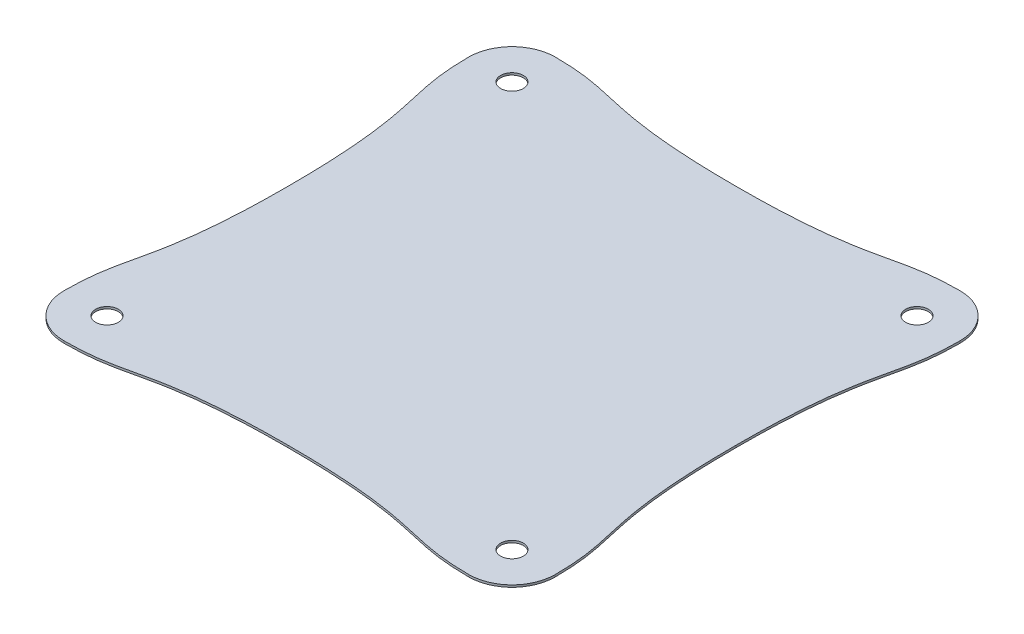
ISO-10303-21;
HEADER;
FILE_DESCRIPTION(('STEP AP214'),'2;1');
FILE_NAME('part.step','',(''),(''),'','','');
FILE_SCHEMA(('AUTOMOTIVE_DESIGN { 1 0 10303 214 1 1 1 1 }'));
ENDSEC;
DATA;
#1=APPLICATION_CONTEXT('core data for automotive mechanical design processes');
#2=APPLICATION_PROTOCOL_DEFINITION('international standard','automotive_design',2000,#1);
#3=PRODUCT_CONTEXT('',#1,'mechanical');
#4=PRODUCT('Part','Part','',(#3));
#5=PRODUCT_RELATED_PRODUCT_CATEGORY('part','',(#4));
#6=PRODUCT_DEFINITION_FORMATION('','',#4);
#7=PRODUCT_DEFINITION_CONTEXT('part definition',#1,'design');
#8=PRODUCT_DEFINITION('design','',#6,#7);
#9=PRODUCT_DEFINITION_SHAPE('','',#8);
#10=(LENGTH_UNIT() NAMED_UNIT(*) SI_UNIT(.MILLI.,.METRE.));
#11=(NAMED_UNIT(*) PLANE_ANGLE_UNIT() SI_UNIT($,.RADIAN.));
#12=(NAMED_UNIT(*) SI_UNIT($,.STERADIAN.) SOLID_ANGLE_UNIT());
#13=UNCERTAINTY_MEASURE_WITH_UNIT(LENGTH_MEASURE(1.E-05),#10,'distance_accuracy_value','');
#14=(GEOMETRIC_REPRESENTATION_CONTEXT(3) GLOBAL_UNCERTAINTY_ASSIGNED_CONTEXT((#13)) GLOBAL_UNIT_ASSIGNED_CONTEXT((#10,
#11,#12)) REPRESENTATION_CONTEXT('',''));
#15=CARTESIAN_POINT('',(0.,0.,0.));
#16=DIRECTION('',(0.,0.,1.));
#17=DIRECTION('',(1.,0.,0.));
#18=AXIS2_PLACEMENT_3D('',#15,#16,#17);
#19=CARTESIAN_POINT('',(0.,0.4,-75.));
#20=DIRECTION('',(0.,-1.,0.));
#21=DIRECTION('',(0.,0.,-1.));
#22=AXIS2_PLACEMENT_3D('',#19,#20,#21);
#23=CYLINDRICAL_SURFACE('',#22,8.);
#24=CARTESIAN_POINT('',(0.,0.,-75.));
#25=DIRECTION('',(0.,1.,0.));
#26=DIRECTION('',(0.,0.,1.));
#27=AXIS2_PLACEMENT_3D('',#24,#25,#26);
#28=CIRCLE('',#27,8.);
#29=CARTESIAN_POINT('',(0.,0.,-83.));
#30=VERTEX_POINT('',#29);
#31=CARTESIAN_POINT('',(-8.,0.,-75.));
#32=VERTEX_POINT('',#31);
#33=EDGE_CURVE('E294',#30,#32,#28,.T.);
#34=ORIENTED_EDGE('',*,*,#33,.T.);
#35=DIRECTION('',(0.,-1.,0.));
#36=VECTOR('',#35,1.);
#37=CARTESIAN_POINT('',(-8.,0.4,-75.));
#38=LINE('',#37,#36);
#39=CARTESIAN_POINT('',(-8.,0.4,-75.));
#40=VERTEX_POINT('',#39);
#41=EDGE_CURVE('E11',#40,#32,#38,.T.);
#42=ORIENTED_EDGE('',*,*,#41,.F.);
#43=CARTESIAN_POINT('',(0.,0.4,-75.));
#44=DIRECTION('',(0.,1.,0.));
#45=DIRECTION('',(0.,0.,1.));
#46=AXIS2_PLACEMENT_3D('',#43,#44,#45);
#47=CIRCLE('',#46,8.);
#48=CARTESIAN_POINT('',(0.,0.4,-83.));
#49=VERTEX_POINT('',#48);
#50=EDGE_CURVE('E366',#49,#40,#47,.T.);
#51=ORIENTED_EDGE('',*,*,#50,.F.);
#52=DIRECTION('',(0.,-1.,0.));
#53=VECTOR('',#52,1.);
#54=CARTESIAN_POINT('',(0.,0.4,-83.));
#55=LINE('',#54,#53);
#56=EDGE_CURVE('E52',#49,#30,#55,.T.);
#57=ORIENTED_EDGE('',*,*,#56,.T.);
#58=EDGE_LOOP('',(#34,#42,#51,#57));
#59=FACE_BOUND('',#58,.T.);
#60=ADVANCED_FACE('F35',(#59),#23,.T.);
#61=CARTESIAN_POINT('',(-7.99999999999906,0.4,-74.9999999999999));
#62=CARTESIAN_POINT('',(-7.99999999999922,0.4,-62.4999999999999));
#63=CARTESIAN_POINT('',(-4.,0.4,-62.5));
#64=CARTESIAN_POINT('',(-4.,0.4,-37.5));
#65=B_SPLINE_CURVE_WITH_KNOTS('',3,(#61,#62,#63,#64),.UNSPECIFIED.,.F.,.F.,(4,4),(0.,1.),.UNSPECIFIED.);
#66=DIRECTION('',(0.,-1.,0.));
#67=VECTOR('',#66,1.);
#68=SURFACE_OF_LINEAR_EXTRUSION('',#65,#67);
#69=CARTESIAN_POINT('',(-7.99999999999906,0.,-74.9999999999999));
#70=CARTESIAN_POINT('',(-7.99999999999922,0.,-62.4999999999999));
#71=CARTESIAN_POINT('',(-4.,0.,-62.5));
#72=CARTESIAN_POINT('',(-4.,0.,-37.5));
#73=B_SPLINE_CURVE_WITH_KNOTS('',3,(#69,#70,#71,#72),.UNSPECIFIED.,.F.,.F.,(4,4),(0.,1.),.UNSPECIFIED.);
#74=CARTESIAN_POINT('',(-4.,0.,-37.5));
#75=VERTEX_POINT('',#74);
#76=EDGE_CURVE('E291',#32,#75,#73,.T.);
#77=ORIENTED_EDGE('',*,*,#76,.T.);
#78=DIRECTION('',(0.,-1.,0.));
#79=VECTOR('',#78,1.);
#80=CARTESIAN_POINT('',(-4.,0.4,-37.5));
#81=LINE('',#80,#79);
#82=CARTESIAN_POINT('',(-4.,0.4,-37.5));
#83=VERTEX_POINT('',#82);
#84=EDGE_CURVE('E44',#83,#75,#81,.T.);
#85=ORIENTED_EDGE('',*,*,#84,.F.);
#86=EDGE_CURVE('E103',#40,#83,#65,.T.);
#87=ORIENTED_EDGE('',*,*,#86,.F.);
#88=ORIENTED_EDGE('',*,*,#41,.T.);
#89=EDGE_LOOP('',(#77,#85,#87,#88));
#90=FACE_BOUND('',#89,.T.);
#91=ADVANCED_FACE('F229',(#90),#68,.F.);
#92=CARTESIAN_POINT('',(-7.99999999999987,0.4,0.));
#93=CARTESIAN_POINT('',(-7.99999999999974,0.4,-12.4999999999999));
#94=CARTESIAN_POINT('',(-4.00000000000002,0.4,-12.5));
#95=CARTESIAN_POINT('',(-4.,0.4,-37.5));
#96=B_SPLINE_CURVE_WITH_KNOTS('',3,(#92,#93,#94,#95),.UNSPECIFIED.,.F.,.F.,(4,4),(0.,1.),.UNSPECIFIED.);
#97=DIRECTION('',(0.,-1.,0.));
#98=VECTOR('',#97,1.);
#99=SURFACE_OF_LINEAR_EXTRUSION('',#96,#98);
#100=CARTESIAN_POINT('',(-7.99999999999987,0.,0.));
#101=CARTESIAN_POINT('',(-7.99999999999974,0.,-12.4999999999999));
#102=CARTESIAN_POINT('',(-4.00000000000002,0.,-12.5));
#103=CARTESIAN_POINT('',(-4.,0.,-37.5));
#104=B_SPLINE_CURVE_WITH_KNOTS('',3,(#100,#101,#102,#103),.UNSPECIFIED.,.F.,.F.,(4,4),(0.,1.),.UNSPECIFIED.);
#105=CARTESIAN_POINT('',(-7.99999999999915,0.,-2.93902320845243E-13));
#106=VERTEX_POINT('',#105);
#107=EDGE_CURVE('E290',#106,#75,#104,.T.);
#108=ORIENTED_EDGE('',*,*,#107,.F.);
#109=DIRECTION('',(0.,-1.,0.));
#110=VECTOR('',#109,1.);
#111=CARTESIAN_POINT('',(-7.99999999999915,0.4,-2.93902320845243E-13));
#112=LINE('',#111,#110);
#113=CARTESIAN_POINT('',(-7.99999999999915,0.4,-2.93902320845243E-13));
#114=VERTEX_POINT('',#113);
#115=EDGE_CURVE('E286',#114,#106,#112,.T.);
#116=ORIENTED_EDGE('',*,*,#115,.F.);
#117=EDGE_CURVE('E233',#114,#83,#96,.T.);
#118=ORIENTED_EDGE('',*,*,#117,.T.);
#119=ORIENTED_EDGE('',*,*,#84,.T.);
#120=EDGE_LOOP('',(#108,#116,#118,#119));
#121=FACE_BOUND('',#120,.T.);
#122=ADVANCED_FACE('F224',(#121),#99,.T.);
#123=CARTESIAN_POINT('',(8.46545056276682E-13,0.4,-2.4980018054066E-13));
#124=DIRECTION('',(0.,-1.,0.));
#125=DIRECTION('',(0.,0.,-1.));
#126=AXIS2_PLACEMENT_3D('',#123,#124,#125);
#127=CYLINDRICAL_SURFACE('',#126,8.);
#128=CARTESIAN_POINT('',(8.46545056276682E-13,0.,-2.4980018054066E-13));
#129=DIRECTION('',(0.,1.,0.));
#130=DIRECTION('',(0.,0.,1.));
#131=AXIS2_PLACEMENT_3D('',#128,#129,#130);
#132=CIRCLE('',#131,8.);
#133=CARTESIAN_POINT('',(8.46545056276682E-13,0.,7.99999999999975));
#134=VERTEX_POINT('',#133);
#135=EDGE_CURVE('E298',#106,#134,#132,.T.);
#136=ORIENTED_EDGE('',*,*,#135,.T.);
#137=DIRECTION('',(0.,-1.,0.));
#138=VECTOR('',#137,1.);
#139=CARTESIAN_POINT('',(8.46545056276682E-13,0.4,7.99999999999975));
#140=LINE('',#139,#138);
#141=CARTESIAN_POINT('',(8.46545056276682E-13,0.4,7.99999999999975));
#142=VERTEX_POINT('',#141);
#143=EDGE_CURVE('E259',#142,#134,#140,.T.);
#144=ORIENTED_EDGE('',*,*,#143,.F.);
#145=CARTESIAN_POINT('',(8.46545056276682E-13,0.4,-2.4980018054066E-13));
#146=DIRECTION('',(0.,1.,0.));
#147=DIRECTION('',(0.,0.,1.));
#148=AXIS2_PLACEMENT_3D('',#145,#146,#147);
#149=CIRCLE('',#148,8.);
#150=EDGE_CURVE('E238',#114,#142,#149,.T.);
#151=ORIENTED_EDGE('',*,*,#150,.F.);
#152=ORIENTED_EDGE('',*,*,#115,.T.);
#153=EDGE_LOOP('',(#136,#144,#151,#152));
#154=FACE_BOUND('',#153,.T.);
#155=ADVANCED_FACE('F220',(#154),#127,.T.);
#156=CARTESIAN_POINT('',(7.91033905045424E-13,0.4,7.99999999999974));
#157=CARTESIAN_POINT('',(12.5000000000008,0.4,7.99999999999985));
#158=CARTESIAN_POINT('',(12.5,0.4,4.00000000000005));
#159=CARTESIAN_POINT('',(37.5,0.4,4.00000000000003));
#160=B_SPLINE_CURVE_WITH_KNOTS('',3,(#156,#157,#158,#159),.UNSPECIFIED.,.F.,.F.,(4,4),(0.,1.),.UNSPECIFIED.);
#161=DIRECTION('',(0.,-1.,0.));
#162=VECTOR('',#161,1.);
#163=SURFACE_OF_LINEAR_EXTRUSION('',#160,#162);
#164=CARTESIAN_POINT('',(7.91033905045424E-13,0.,7.99999999999974));
#165=CARTESIAN_POINT('',(12.5000000000008,0.,7.99999999999985));
#166=CARTESIAN_POINT('',(12.5,0.,4.00000000000005));
#167=CARTESIAN_POINT('',(37.5,0.,4.00000000000003));
#168=B_SPLINE_CURVE_WITH_KNOTS('',3,(#164,#165,#166,#167),.UNSPECIFIED.,.F.,.F.,(4,4),(0.,1.),.UNSPECIFIED.);
#169=CARTESIAN_POINT('',(37.5,0.,4.00000000000003));
#170=VERTEX_POINT('',#169);
#171=EDGE_CURVE('E256',#134,#170,#168,.T.);
#172=ORIENTED_EDGE('',*,*,#171,.T.);
#173=DIRECTION('',(0.,-1.,0.));
#174=VECTOR('',#173,1.);
#175=CARTESIAN_POINT('',(37.5,0.4,4.00000000000003));
#176=LINE('',#175,#174);
#177=CARTESIAN_POINT('',(37.5,0.4,4.00000000000003));
#178=VERTEX_POINT('',#177);
#179=EDGE_CURVE('E254',#178,#170,#176,.T.);
#180=ORIENTED_EDGE('',*,*,#179,.F.);
#181=EDGE_CURVE('E203',#142,#178,#160,.T.);
#182=ORIENTED_EDGE('',*,*,#181,.F.);
#183=ORIENTED_EDGE('',*,*,#143,.T.);
#184=EDGE_LOOP('',(#172,#180,#182,#183));
#185=FACE_BOUND('',#184,.T.);
#186=ADVANCED_FACE('F216',(#185),#163,.F.);
#187=CARTESIAN_POINT('',(75.0000000000008,0.4,8.00000000000028));
#188=CARTESIAN_POINT('',(62.5000000000008,0.4,8.0000000000002));
#189=CARTESIAN_POINT('',(62.5,0.4,4.00000000000003));
#190=CARTESIAN_POINT('',(37.5,0.4,4.00000000000003));
#191=B_SPLINE_CURVE_WITH_KNOTS('',3,(#187,#188,#189,#190),.UNSPECIFIED.,.F.,.F.,(4,4),(0.,1.),.UNSPECIFIED.);
#192=DIRECTION('',(0.,-1.,0.));
#193=VECTOR('',#192,1.);
#194=SURFACE_OF_LINEAR_EXTRUSION('',#191,#193);
#195=CARTESIAN_POINT('',(75.0000000000008,0.,8.00000000000028));
#196=CARTESIAN_POINT('',(62.5000000000008,0.,8.0000000000002));
#197=CARTESIAN_POINT('',(62.5,0.,4.00000000000003));
#198=CARTESIAN_POINT('',(37.5,0.,4.00000000000003));
#199=B_SPLINE_CURVE_WITH_KNOTS('',3,(#195,#196,#197,#198),.UNSPECIFIED.,.F.,.F.,(4,4),(0.,1.),.UNSPECIFIED.);
#200=CARTESIAN_POINT('',(75.0000000000005,0.,7.99999999999959));
#201=VERTEX_POINT('',#200);
#202=EDGE_CURVE('E263',#201,#170,#199,.T.);
#203=ORIENTED_EDGE('',*,*,#202,.F.);
#204=DIRECTION('',(0.,-1.,0.));
#205=VECTOR('',#204,1.);
#206=CARTESIAN_POINT('',(75.0000000000005,0.4,7.99999999999959));
#207=LINE('',#206,#205);
#208=CARTESIAN_POINT('',(75.0000000000005,0.4,7.99999999999959));
#209=VERTEX_POINT('',#208);
#210=EDGE_CURVE('E260',#209,#201,#207,.T.);
#211=ORIENTED_EDGE('',*,*,#210,.F.);
#212=EDGE_CURVE('E197',#209,#178,#191,.T.);
#213=ORIENTED_EDGE('',*,*,#212,.T.);
#214=ORIENTED_EDGE('',*,*,#179,.T.);
#215=EDGE_LOOP('',(#203,#211,#213,#214));
#216=FACE_BOUND('',#215,.T.);
#217=ADVANCED_FACE('F212',(#216),#194,.T.);
#218=CARTESIAN_POINT('',(75.0000000000005,0.4,-4.02455846426619E-13));
#219=DIRECTION('',(0.,-1.,0.));
#220=DIRECTION('',(0.,0.,-1.));
#221=AXIS2_PLACEMENT_3D('',#218,#219,#220);
#222=CYLINDRICAL_SURFACE('',#221,7.99999999999999);
#223=CARTESIAN_POINT('',(75.0000000000005,0.,-4.02455846426619E-13));
#224=DIRECTION('',(0.,1.,0.));
#225=DIRECTION('',(0.,0.,1.));
#226=AXIS2_PLACEMENT_3D('',#223,#224,#225);
#227=CIRCLE('',#226,7.99999999999999);
#228=CARTESIAN_POINT('',(83.0000000000005,0.,-3.73544278276556E-13));
#229=VERTEX_POINT('',#228);
#230=EDGE_CURVE('E319',#201,#229,#227,.T.);
#231=ORIENTED_EDGE('',*,*,#230,.T.);
#232=DIRECTION('',(0.,-1.,0.));
#233=VECTOR('',#232,1.);
#234=CARTESIAN_POINT('',(83.0000000000005,0.4,-3.73544278276556E-13));
#235=LINE('',#234,#233);
#236=CARTESIAN_POINT('',(83.0000000000005,0.4,-3.73544278276556E-13));
#237=VERTEX_POINT('',#236);
#238=EDGE_CURVE('E266',#237,#229,#235,.T.);
#239=ORIENTED_EDGE('',*,*,#238,.F.);
#240=CARTESIAN_POINT('',(75.0000000000005,0.4,-4.02455846426619E-13));
#241=DIRECTION('',(0.,1.,0.));
#242=DIRECTION('',(0.,0.,1.));
#243=AXIS2_PLACEMENT_3D('',#240,#241,#242);
#244=CIRCLE('',#243,7.99999999999999);
#245=EDGE_CURVE('E192',#209,#237,#244,.T.);
#246=ORIENTED_EDGE('',*,*,#245,.F.);
#247=ORIENTED_EDGE('',*,*,#210,.T.);
#248=EDGE_LOOP('',(#231,#239,#246,#247));
#249=FACE_BOUND('',#248,.T.);
#250=ADVANCED_FACE('F215',(#249),#222,.T.);
#251=CARTESIAN_POINT('',(83.0000000000004,0.4,-3.7470027081099E-13));
#252=CARTESIAN_POINT('',(83.0000000000005,0.4,-12.5000000000004));
#253=CARTESIAN_POINT('',(79.,0.4,-12.5));
#254=CARTESIAN_POINT('',(79.,0.4,-37.5));
#255=B_SPLINE_CURVE_WITH_KNOTS('',3,(#251,#252,#253,#254),.UNSPECIFIED.,.F.,.F.,(4,4),(0.,1.),.UNSPECIFIED.);
#256=DIRECTION('',(0.,-1.,0.));
#257=VECTOR('',#256,1.);
#258=SURFACE_OF_LINEAR_EXTRUSION('',#255,#257);
#259=CARTESIAN_POINT('',(83.0000000000004,0.,-3.7470027081099E-13));
#260=CARTESIAN_POINT('',(83.0000000000005,0.,-12.5000000000004));
#261=CARTESIAN_POINT('',(79.,0.,-12.5));
#262=CARTESIAN_POINT('',(79.,0.,-37.5));
#263=B_SPLINE_CURVE_WITH_KNOTS('',3,(#259,#260,#261,#262),.UNSPECIFIED.,.F.,.F.,(4,4),(0.,1.),.UNSPECIFIED.);
#264=CARTESIAN_POINT('',(79.,0.,-37.5));
#265=VERTEX_POINT('',#264);
#266=EDGE_CURVE('E276',#229,#265,#263,.T.);
#267=ORIENTED_EDGE('',*,*,#266,.T.);
#268=DIRECTION('',(0.,-1.,0.));
#269=VECTOR('',#268,1.);
#270=CARTESIAN_POINT('',(79.,0.4,-37.5));
#271=LINE('',#270,#269);
#272=CARTESIAN_POINT('',(79.,0.4,-37.5));
#273=VERTEX_POINT('',#272);
#274=EDGE_CURVE('E274',#273,#265,#271,.T.);
#275=ORIENTED_EDGE('',*,*,#274,.F.);
#276=EDGE_CURVE('E184',#237,#273,#255,.T.);
#277=ORIENTED_EDGE('',*,*,#276,.F.);
#278=ORIENTED_EDGE('',*,*,#238,.T.);
#279=EDGE_LOOP('',(#267,#275,#277,#278));
#280=FACE_BOUND('',#279,.T.);
#281=ADVANCED_FACE('F177',(#280),#258,.F.);
#282=CARTESIAN_POINT('',(83.0000000000007,0.4,-75.0000000000004));
#283=CARTESIAN_POINT('',(83.0000000000007,0.4,-62.5000000000004));
#284=CARTESIAN_POINT('',(79.,0.4,-62.5));
#285=CARTESIAN_POINT('',(79.,0.4,-37.5));
#286=B_SPLINE_CURVE_WITH_KNOTS('',3,(#282,#283,#284,#285),.UNSPECIFIED.,.F.,.F.,(4,4),(0.,1.),.UNSPECIFIED.);
#287=DIRECTION('',(0.,-1.,0.));
#288=VECTOR('',#287,1.);
#289=SURFACE_OF_LINEAR_EXTRUSION('',#286,#288);
#290=CARTESIAN_POINT('',(83.0000000000007,0.,-75.0000000000004));
#291=CARTESIAN_POINT('',(83.0000000000007,0.,-62.5000000000004));
#292=CARTESIAN_POINT('',(79.,0.,-62.5));
#293=CARTESIAN_POINT('',(79.,0.,-37.5));
#294=B_SPLINE_CURVE_WITH_KNOTS('',3,(#290,#291,#292,#293),.UNSPECIFIED.,.F.,.F.,(4,4),(0.,1.),.UNSPECIFIED.);
#295=CARTESIAN_POINT('',(83.0000000000002,0.,-75.));
#296=VERTEX_POINT('',#295);
#297=EDGE_CURVE('E280',#296,#265,#294,.T.);
#298=ORIENTED_EDGE('',*,*,#297,.F.);
#299=DIRECTION('',(0.,-1.,0.));
#300=VECTOR('',#299,1.);
#301=CARTESIAN_POINT('',(83.0000000000002,0.4,-75.));
#302=LINE('',#301,#300);
#303=CARTESIAN_POINT('',(83.0000000000002,0.4,-75.));
#304=VERTEX_POINT('',#303);
#305=EDGE_CURVE('E148',#304,#296,#302,.T.);
#306=ORIENTED_EDGE('',*,*,#305,.F.);
#307=EDGE_CURVE('E138',#304,#273,#286,.T.);
#308=ORIENTED_EDGE('',*,*,#307,.T.);
#309=ORIENTED_EDGE('',*,*,#274,.T.);
#310=EDGE_LOOP('',(#298,#306,#308,#309));
#311=FACE_BOUND('',#310,.T.);
#312=ADVANCED_FACE('F174',(#311),#289,.T.);
#313=CARTESIAN_POINT('',(75.0000000000007,0.4,-75.0000000000004));
#314=DIRECTION('',(0.,-1.,0.));
#315=DIRECTION('',(0.,0.,-1.));
#316=AXIS2_PLACEMENT_3D('',#313,#314,#315);
#317=CYLINDRICAL_SURFACE('',#316,7.99999999999945);
#318=CARTESIAN_POINT('',(75.0000000000007,0.,-75.0000000000004));
#319=DIRECTION('',(0.,1.,0.));
#320=DIRECTION('',(0.,0.,1.));
#321=AXIS2_PLACEMENT_3D('',#318,#319,#320);
#322=CIRCLE('',#321,7.99999999999945);
#323=CARTESIAN_POINT('',(75.,0.,-82.9999999999999));
#324=VERTEX_POINT('',#323);
#325=EDGE_CURVE('E145',#296,#324,#322,.T.);
#326=ORIENTED_EDGE('',*,*,#325,.T.);
#327=DIRECTION('',(0.,-1.,0.));
#328=VECTOR('',#327,1.);
#329=CARTESIAN_POINT('',(75.,0.4,-82.9999999999999));
#330=LINE('',#329,#328);
#331=CARTESIAN_POINT('',(75.,0.4,-82.9999999999999));
#332=VERTEX_POINT('',#331);
#333=EDGE_CURVE('E142',#332,#324,#330,.T.);
#334=ORIENTED_EDGE('',*,*,#333,.F.);
#335=CARTESIAN_POINT('',(75.0000000000007,0.4,-75.0000000000004));
#336=DIRECTION('',(0.,1.,0.));
#337=DIRECTION('',(0.,0.,1.));
#338=AXIS2_PLACEMENT_3D('',#335,#336,#337);
#339=CIRCLE('',#338,7.99999999999945);
#340=EDGE_CURVE('E131',#304,#332,#339,.T.);
#341=ORIENTED_EDGE('',*,*,#340,.F.);
#342=ORIENTED_EDGE('',*,*,#305,.T.);
#343=EDGE_LOOP('',(#326,#334,#341,#342));
#344=FACE_BOUND('',#343,.T.);
#345=ADVANCED_FACE('F143',(#344),#317,.T.);
#346=CARTESIAN_POINT('',(75.,0.4,-83.));
#347=CARTESIAN_POINT('',(62.5,0.4,-83.));
#348=CARTESIAN_POINT('',(62.5,0.4,-79.));
#349=CARTESIAN_POINT('',(37.5,0.4,-79.));
#350=B_SPLINE_CURVE_WITH_KNOTS('',3,(#346,#347,#348,#349),.UNSPECIFIED.,.F.,.F.,(4,4),(0.,1.),.UNSPECIFIED.);
#351=DIRECTION('',(0.,-1.,0.));
#352=VECTOR('',#351,1.);
#353=SURFACE_OF_LINEAR_EXTRUSION('',#350,#352);
#354=CARTESIAN_POINT('',(75.,0.,-83.));
#355=CARTESIAN_POINT('',(62.5,0.,-83.));
#356=CARTESIAN_POINT('',(62.5,0.,-79.));
#357=CARTESIAN_POINT('',(37.5,0.,-79.));
#358=B_SPLINE_CURVE_WITH_KNOTS('',3,(#354,#355,#356,#357),.UNSPECIFIED.,.F.,.F.,(4,4),(0.,1.),.UNSPECIFIED.);
#359=CARTESIAN_POINT('',(37.5,0.,-79.));
#360=VERTEX_POINT('',#359);
#361=EDGE_CURVE('E337',#324,#360,#358,.T.);
#362=ORIENTED_EDGE('',*,*,#361,.T.);
#363=DIRECTION('',(0.,-1.,0.));
#364=VECTOR('',#363,1.);
#365=CARTESIAN_POINT('',(37.5,0.4,-79.));
#366=LINE('',#365,#364);
#367=CARTESIAN_POINT('',(37.5,0.4,-79.));
#368=VERTEX_POINT('',#367);
#369=EDGE_CURVE('E91',#368,#360,#366,.T.);
#370=ORIENTED_EDGE('',*,*,#369,.F.);
#371=EDGE_CURVE('E136',#332,#368,#350,.T.);
#372=ORIENTED_EDGE('',*,*,#371,.F.);
#373=ORIENTED_EDGE('',*,*,#333,.T.);
#374=EDGE_LOOP('',(#362,#370,#372,#373));
#375=FACE_BOUND('',#374,.T.);
#376=ADVANCED_FACE('F150',(#375),#353,.F.);
#377=CARTESIAN_POINT('',(0.,0.4,0.));
#378=DIRECTION('',(0.,-1.,0.));
#379=DIRECTION('',(0.,0.,-1.));
#380=AXIS2_PLACEMENT_3D('',#377,#378,#379);
#381=CYLINDRICAL_SURFACE('',#380,2.1);
#382=CARTESIAN_POINT('',(0.,0.4,0.));
#383=DIRECTION('',(0.,1.,0.));
#384=DIRECTION('',(0.,0.,1.));
#385=AXIS2_PLACEMENT_3D('',#382,#383,#384);
#386=CIRCLE('',#385,2.1);
#387=CARTESIAN_POINT('',(0.,0.4,2.1));
#388=VERTEX_POINT('',#387);
#389=EDGE_CURVE('E364',#388,#388,#386,.T.);
#390=ORIENTED_EDGE('',*,*,#389,.T.);
#391=EDGE_LOOP('',(#390));
#392=FACE_BOUND('',#391,.T.);
#393=CARTESIAN_POINT('',(0.,0.,0.));
#394=DIRECTION('',(0.,1.,0.));
#395=DIRECTION('',(0.,0.,1.));
#396=AXIS2_PLACEMENT_3D('',#393,#394,#395);
#397=CIRCLE('',#396,2.1);
#398=CARTESIAN_POINT('',(0.,0.,2.1));
#399=VERTEX_POINT('',#398);
#400=EDGE_CURVE('E367',#399,#399,#397,.T.);
#401=ORIENTED_EDGE('',*,*,#400,.F.);
#402=EDGE_LOOP('',(#401));
#403=FACE_BOUND('',#402,.T.);
#404=ADVANCED_FACE('F169',(#392,#403),#381,.F.);
#405=CARTESIAN_POINT('',(75.,0.4,0.));
#406=DIRECTION('',(0.,-1.,0.));
#407=DIRECTION('',(0.,0.,-1.));
#408=AXIS2_PLACEMENT_3D('',#405,#406,#407);
#409=CYLINDRICAL_SURFACE('',#408,2.1);
#410=CARTESIAN_POINT('',(75.,0.4,0.));
#411=DIRECTION('',(0.,1.,0.));
#412=DIRECTION('',(0.,0.,1.));
#413=AXIS2_PLACEMENT_3D('',#410,#411,#412);
#414=CIRCLE('',#413,2.1);
#415=CARTESIAN_POINT('',(75.,0.4,2.1));
#416=VERTEX_POINT('',#415);
#417=EDGE_CURVE('E359',#416,#416,#414,.T.);
#418=ORIENTED_EDGE('',*,*,#417,.T.);
#419=EDGE_LOOP('',(#418));
#420=FACE_BOUND('',#419,.T.);
#421=CARTESIAN_POINT('',(75.,0.,0.));
#422=DIRECTION('',(0.,1.,0.));
#423=DIRECTION('',(0.,0.,1.));
#424=AXIS2_PLACEMENT_3D('',#421,#422,#423);
#425=CIRCLE('',#424,2.1);
#426=CARTESIAN_POINT('',(75.,0.,2.1));
#427=VERTEX_POINT('',#426);
#428=EDGE_CURVE('E369',#427,#427,#425,.T.);
#429=ORIENTED_EDGE('',*,*,#428,.F.);
#430=EDGE_LOOP('',(#429));
#431=FACE_BOUND('',#430,.T.);
#432=ADVANCED_FACE('F388',(#420,#431),#409,.F.);
#433=CARTESIAN_POINT('',(75.0000000000007,0.4,-75.0000000000004));
#434=DIRECTION('',(0.,-1.,0.));
#435=DIRECTION('',(0.,0.,-1.));
#436=AXIS2_PLACEMENT_3D('',#433,#434,#435);
#437=CYLINDRICAL_SURFACE('',#436,2.09999999999922);
#438=CARTESIAN_POINT('',(75.0000000000007,0.4,-75.0000000000004));
#439=DIRECTION('',(0.,1.,0.));
#440=DIRECTION('',(0.,0.,1.));
#441=AXIS2_PLACEMENT_3D('',#438,#439,#440);
#442=CIRCLE('',#441,2.09999999999922);
#443=CARTESIAN_POINT('',(75.0000000000007,0.4,-72.9000000000012));
#444=VERTEX_POINT('',#443);
#445=EDGE_CURVE('E354',#444,#444,#442,.T.);
#446=ORIENTED_EDGE('',*,*,#445,.T.);
#447=EDGE_LOOP('',(#446));
#448=FACE_BOUND('',#447,.T.);
#449=CARTESIAN_POINT('',(75.0000000000007,0.,-75.0000000000004));
#450=DIRECTION('',(0.,1.,0.));
#451=DIRECTION('',(0.,0.,1.));
#452=AXIS2_PLACEMENT_3D('',#449,#450,#451);
#453=CIRCLE('',#452,2.09999999999922);
#454=CARTESIAN_POINT('',(75.0000000000007,0.,-72.9000000000012));
#455=VERTEX_POINT('',#454);
#456=EDGE_CURVE('E374',#455,#455,#453,.T.);
#457=ORIENTED_EDGE('',*,*,#456,.F.);
#458=EDGE_LOOP('',(#457));
#459=FACE_BOUND('',#458,.T.);
#460=ADVANCED_FACE('F383',(#448,#459),#437,.F.);
#461=CARTESIAN_POINT('',(0.,0.4,-75.));
#462=DIRECTION('',(0.,-1.,0.));
#463=DIRECTION('',(0.,0.,-1.));
#464=AXIS2_PLACEMENT_3D('',#461,#462,#463);
#465=CYLINDRICAL_SURFACE('',#464,2.1);
#466=CARTESIAN_POINT('',(0.,0.4,-75.));
#467=DIRECTION('',(0.,1.,0.));
#468=DIRECTION('',(0.,0.,1.));
#469=AXIS2_PLACEMENT_3D('',#466,#467,#468);
#470=CIRCLE('',#469,2.1);
#471=CARTESIAN_POINT('',(0.,0.4,-72.9));
#472=VERTEX_POINT('',#471);
#473=EDGE_CURVE('E349',#472,#472,#470,.T.);
#474=ORIENTED_EDGE('',*,*,#473,.T.);
#475=EDGE_LOOP('',(#474));
#476=FACE_BOUND('',#475,.T.);
#477=CARTESIAN_POINT('',(0.,0.,-75.));
#478=DIRECTION('',(0.,1.,0.));
#479=DIRECTION('',(0.,0.,1.));
#480=AXIS2_PLACEMENT_3D('',#477,#478,#479);
#481=CIRCLE('',#480,2.1);
#482=CARTESIAN_POINT('',(0.,0.,-72.9));
#483=VERTEX_POINT('',#482);
#484=EDGE_CURVE('E376',#483,#483,#481,.T.);
#485=ORIENTED_EDGE('',*,*,#484,.F.);
#486=EDGE_LOOP('',(#485));
#487=FACE_BOUND('',#486,.T.);
#488=ADVANCED_FACE('F37',(#476,#487),#465,.F.);
#489=CARTESIAN_POINT('',(0.,0.4,-83.));
#490=CARTESIAN_POINT('',(12.5,0.4,-83.));
#491=CARTESIAN_POINT('',(12.5,0.4,-79.));
#492=CARTESIAN_POINT('',(37.5,0.4,-79.));
#493=B_SPLINE_CURVE_WITH_KNOTS('',3,(#489,#490,#491,#492),.UNSPECIFIED.,.F.,.F.,(4,4),(0.,1.),.UNSPECIFIED.);
#494=DIRECTION('',(0.,-1.,0.));
#495=VECTOR('',#494,1.);
#496=SURFACE_OF_LINEAR_EXTRUSION('',#493,#495);
#497=CARTESIAN_POINT('',(0.,0.,-83.));
#498=CARTESIAN_POINT('',(12.5,0.,-83.));
#499=CARTESIAN_POINT('',(12.5,0.,-79.));
#500=CARTESIAN_POINT('',(37.5,0.,-79.));
#501=B_SPLINE_CURVE_WITH_KNOTS('',3,(#497,#498,#499,#500),.UNSPECIFIED.,.F.,.F.,(4,4),(0.,1.),.UNSPECIFIED.);
#502=EDGE_CURVE('E341',#30,#360,#501,.T.);
#503=ORIENTED_EDGE('',*,*,#502,.F.);
#504=ORIENTED_EDGE('',*,*,#56,.F.);
#505=EDGE_CURVE('E151',#49,#368,#493,.T.);
#506=ORIENTED_EDGE('',*,*,#505,.T.);
#507=ORIENTED_EDGE('',*,*,#369,.T.);
#508=EDGE_LOOP('',(#503,#504,#506,#507));
#509=FACE_BOUND('',#508,.T.);
#510=ADVANCED_FACE('F170',(#509),#496,.T.);
#511=CARTESIAN_POINT('',(0.,0.4,0.));
#512=DIRECTION('',(0.,1.,0.));
#513=DIRECTION('',(0.,0.,1.));
#514=AXIS2_PLACEMENT_3D('',#511,#512,#513);
#515=PLANE('',#514);
#516=ORIENTED_EDGE('',*,*,#473,.F.);
#517=EDGE_LOOP('',(#516));
#518=FACE_BOUND('',#517,.T.);
#519=ORIENTED_EDGE('',*,*,#445,.F.);
#520=EDGE_LOOP('',(#519));
#521=FACE_BOUND('',#520,.T.);
#522=ORIENTED_EDGE('',*,*,#417,.F.);
#523=EDGE_LOOP('',(#522));
#524=FACE_BOUND('',#523,.T.);
#525=ORIENTED_EDGE('',*,*,#389,.F.);
#526=EDGE_LOOP('',(#525));
#527=FACE_BOUND('',#526,.T.);
#528=ORIENTED_EDGE('',*,*,#50,.T.);
#529=ORIENTED_EDGE('',*,*,#86,.T.);
#530=ORIENTED_EDGE('',*,*,#117,.F.);
#531=ORIENTED_EDGE('',*,*,#150,.T.);
#532=ORIENTED_EDGE('',*,*,#181,.T.);
#533=ORIENTED_EDGE('',*,*,#212,.F.);
#534=ORIENTED_EDGE('',*,*,#245,.T.);
#535=ORIENTED_EDGE('',*,*,#276,.T.);
#536=ORIENTED_EDGE('',*,*,#307,.F.);
#537=ORIENTED_EDGE('',*,*,#340,.T.);
#538=ORIENTED_EDGE('',*,*,#371,.T.);
#539=ORIENTED_EDGE('',*,*,#505,.F.);
#540=EDGE_LOOP('',(#528,#529,#530,#531,#532,#533,#534,#535,#536,#537,#538,#539));
#541=FACE_BOUND('',#540,.T.);
#542=ADVANCED_FACE('F133',(#518,#521,#524,#527,#541),#515,.T.);
#543=CARTESIAN_POINT('',(0.,0.,0.));
#544=DIRECTION('',(0.,1.,0.));
#545=DIRECTION('',(0.,0.,1.));
#546=AXIS2_PLACEMENT_3D('',#543,#544,#545);
#547=PLANE('',#546);
#548=ORIENTED_EDGE('',*,*,#484,.T.);
#549=EDGE_LOOP('',(#548));
#550=FACE_BOUND('',#549,.T.);
#551=ORIENTED_EDGE('',*,*,#456,.T.);
#552=EDGE_LOOP('',(#551));
#553=FACE_BOUND('',#552,.T.);
#554=ORIENTED_EDGE('',*,*,#428,.T.);
#555=EDGE_LOOP('',(#554));
#556=FACE_BOUND('',#555,.T.);
#557=ORIENTED_EDGE('',*,*,#400,.T.);
#558=EDGE_LOOP('',(#557));
#559=FACE_BOUND('',#558,.T.);
#560=ORIENTED_EDGE('',*,*,#33,.F.);
#561=ORIENTED_EDGE('',*,*,#502,.T.);
#562=ORIENTED_EDGE('',*,*,#361,.F.);
#563=ORIENTED_EDGE('',*,*,#325,.F.);
#564=ORIENTED_EDGE('',*,*,#297,.T.);
#565=ORIENTED_EDGE('',*,*,#266,.F.);
#566=ORIENTED_EDGE('',*,*,#230,.F.);
#567=ORIENTED_EDGE('',*,*,#202,.T.);
#568=ORIENTED_EDGE('',*,*,#171,.F.);
#569=ORIENTED_EDGE('',*,*,#135,.F.);
#570=ORIENTED_EDGE('',*,*,#107,.T.);
#571=ORIENTED_EDGE('',*,*,#76,.F.);
#572=EDGE_LOOP('',(#560,#561,#562,#563,#564,#565,#566,#567,#568,#569,#570,#571));
#573=FACE_BOUND('',#572,.T.);
#574=ADVANCED_FACE('F297',(#550,#553,#556,#559,#573),#547,.F.);
#575=CLOSED_SHELL('',(#60,#91,#122,#155,#186,#217,#250,#281,#312,#345,#376,#404,#432,#460,#488,
#510,#542,#574));
#576=MANIFOLD_SOLID_BREP('B2',#575);
#577=ADVANCED_BREP_SHAPE_REPRESENTATION('',(#18,#576),#14);
#578=SHAPE_DEFINITION_REPRESENTATION(#9,#577);
ENDSEC;
END-ISO-10303-21;
